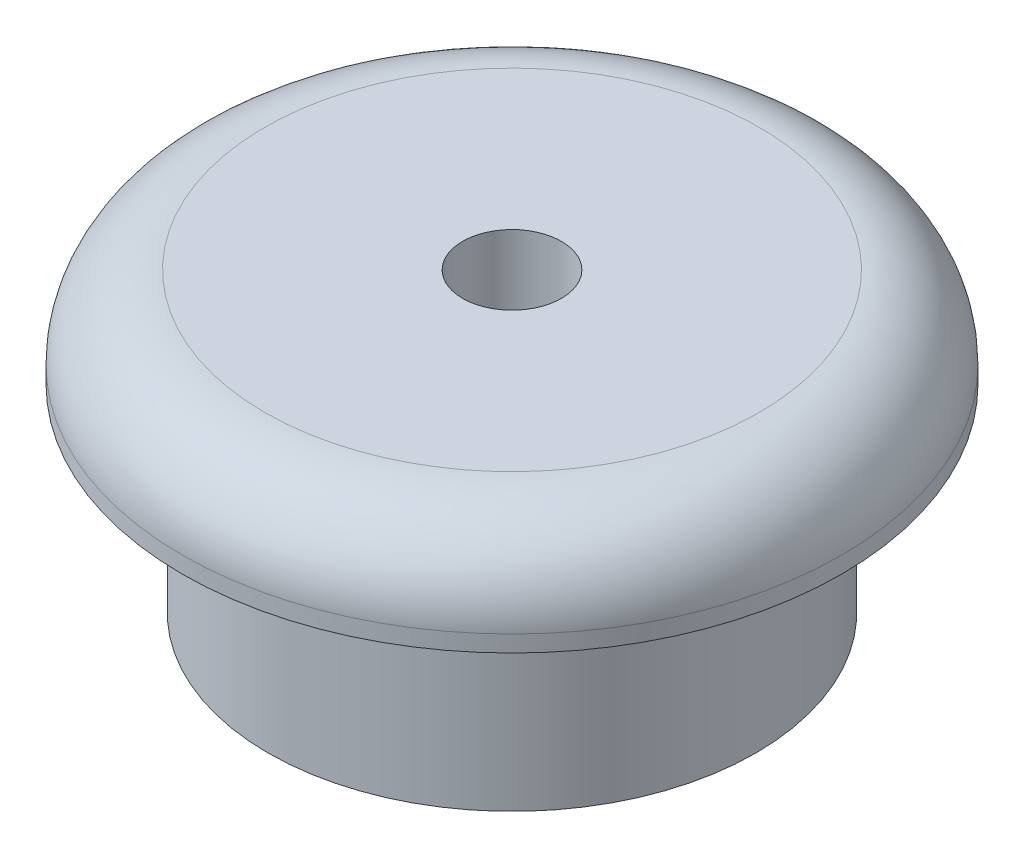
ISO-10303-21;
HEADER;
FILE_DESCRIPTION(('STEP AP214'),'2;1');
FILE_NAME('part.step','',(''),(''),'','','');
FILE_SCHEMA(('AUTOMOTIVE_DESIGN { 1 0 10303 214 1 1 1 1 }'));
ENDSEC;
DATA;
#1=APPLICATION_CONTEXT('core data for automotive mechanical design processes');
#2=APPLICATION_PROTOCOL_DEFINITION('international standard','automotive_design',2000,#1);
#3=PRODUCT_CONTEXT('',#1,'mechanical');
#4=PRODUCT('Part','Part','',(#3));
#5=PRODUCT_RELATED_PRODUCT_CATEGORY('part','',(#4));
#6=PRODUCT_DEFINITION_FORMATION('','',#4);
#7=PRODUCT_DEFINITION_CONTEXT('part definition',#1,'design');
#8=PRODUCT_DEFINITION('design','',#6,#7);
#9=PRODUCT_DEFINITION_SHAPE('','',#8);
#10=(LENGTH_UNIT() NAMED_UNIT(*) SI_UNIT(.MILLI.,.METRE.));
#11=(NAMED_UNIT(*) PLANE_ANGLE_UNIT() SI_UNIT($,.RADIAN.));
#12=(NAMED_UNIT(*) SI_UNIT($,.STERADIAN.) SOLID_ANGLE_UNIT());
#13=UNCERTAINTY_MEASURE_WITH_UNIT(LENGTH_MEASURE(1.E-05),#10,'distance_accuracy_value','');
#14=(GEOMETRIC_REPRESENTATION_CONTEXT(3) GLOBAL_UNCERTAINTY_ASSIGNED_CONTEXT((#13)) GLOBAL_UNIT_ASSIGNED_CONTEXT((#10,
#11,#12)) REPRESENTATION_CONTEXT('',''));
#15=CARTESIAN_POINT('',(0.,0.,0.));
#16=DIRECTION('',(0.,0.,1.));
#17=DIRECTION('',(1.,0.,0.));
#18=AXIS2_PLACEMENT_3D('',#15,#16,#17);
#19=CARTESIAN_POINT('',(0.,0.,0.));
#20=DIRECTION('',(0.,1.,0.));
#21=DIRECTION('',(0.,0.,1.));
#22=AXIS2_PLACEMENT_3D('',#19,#20,#21);
#23=PLANE('',#22);
#24=CARTESIAN_POINT('',(0.,0.,0.));
#25=DIRECTION('',(0.,1.,0.));
#26=DIRECTION('',(0.,0.,1.));
#27=AXIS2_PLACEMENT_3D('',#24,#25,#26);
#28=CIRCLE('',#27,7.4);
#29=CARTESIAN_POINT('',(0.,0.,7.4));
#30=VERTEX_POINT('',#29);
#31=EDGE_CURVE('E88',#30,#30,#28,.T.);
#32=ORIENTED_EDGE('',*,*,#31,.F.);
#33=EDGE_LOOP('',(#32));
#34=FACE_BOUND('',#33,.T.);
#35=CARTESIAN_POINT('',(0.,0.,0.));
#36=DIRECTION('',(0.,1.,0.));
#37=DIRECTION('',(0.,0.,1.));
#38=AXIS2_PLACEMENT_3D('',#35,#36,#37);
#39=CIRCLE('',#38,3.125);
#40=CARTESIAN_POINT('',(2.2,0.,-2.21937491199662));
#41=VERTEX_POINT('',#40);
#42=CARTESIAN_POINT('',(2.2,0.,2.21937491199662));
#43=VERTEX_POINT('',#42);
#44=EDGE_CURVE('E69',#41,#43,#39,.T.);
#45=ORIENTED_EDGE('',*,*,#44,.T.);
#46=DIRECTION('',(0.,0.,-1.));
#47=VECTOR('',#46,1.);
#48=CARTESIAN_POINT('',(2.2,0.,-2.21937491199662));
#49=LINE('',#48,#47);
#50=EDGE_CURVE('E78',#43,#41,#49,.T.);
#51=ORIENTED_EDGE('',*,*,#50,.T.);
#52=EDGE_LOOP('',(#45,#51));
#53=FACE_BOUND('',#52,.T.);
#54=ADVANCED_FACE('F47',(#34,#53),#23,.F.);
#55=CARTESIAN_POINT('',(0.,6.,0.));
#56=DIRECTION('',(0.,-1.,0.));
#57=DIRECTION('',(0.,0.,-1.));
#58=AXIS2_PLACEMENT_3D('',#55,#56,#57);
#59=CYLINDRICAL_SURFACE('',#58,7.4);
#60=CARTESIAN_POINT('',(0.,6.,0.));
#61=DIRECTION('',(0.,1.,0.));
#62=DIRECTION('',(0.,0.,1.));
#63=AXIS2_PLACEMENT_3D('',#60,#61,#62);
#64=CIRCLE('',#63,7.4);
#65=CARTESIAN_POINT('',(0.,6.,7.4));
#66=VERTEX_POINT('',#65);
#67=EDGE_CURVE('E93',#66,#66,#64,.T.);
#68=ORIENTED_EDGE('',*,*,#67,.F.);
#69=EDGE_LOOP('',(#68));
#70=FACE_BOUND('',#69,.T.);
#71=ORIENTED_EDGE('',*,*,#31,.T.);
#72=EDGE_LOOP('',(#71));
#73=FACE_BOUND('',#72,.T.);
#74=ADVANCED_FACE('F115',(#70,#73),#59,.T.);
#75=CARTESIAN_POINT('',(0.,6.,0.));
#76=DIRECTION('',(0.,-1.,0.));
#77=DIRECTION('',(0.,0.,-1.));
#78=AXIS2_PLACEMENT_3D('',#75,#76,#77);
#79=CYLINDRICAL_SURFACE('',#78,3.125);
#80=ORIENTED_EDGE('',*,*,#44,.F.);
#81=DIRECTION('',(0.,-1.,0.));
#82=VECTOR('',#81,1.);
#83=CARTESIAN_POINT('',(2.2,6.,-2.21937491199662));
#84=LINE('',#83,#82);
#85=CARTESIAN_POINT('',(2.2,6.,-2.21937491199662));
#86=VERTEX_POINT('',#85);
#87=EDGE_CURVE('E82',#86,#41,#84,.T.);
#88=ORIENTED_EDGE('',*,*,#87,.F.);
#89=CARTESIAN_POINT('',(0.,6.,0.));
#90=DIRECTION('',(0.,1.,0.));
#91=DIRECTION('',(0.,0.,1.));
#92=AXIS2_PLACEMENT_3D('',#89,#90,#91);
#93=CIRCLE('',#92,3.125);
#94=CARTESIAN_POINT('',(2.2,6.,2.21937491199662));
#95=VERTEX_POINT('',#94);
#96=EDGE_CURVE('E76',#86,#95,#93,.T.);
#97=ORIENTED_EDGE('',*,*,#96,.T.);
#98=DIRECTION('',(0.,-1.,0.));
#99=VECTOR('',#98,1.);
#100=CARTESIAN_POINT('',(2.2,6.,2.21937491199662));
#101=LINE('',#100,#99);
#102=EDGE_CURVE('E84',#95,#43,#101,.T.);
#103=ORIENTED_EDGE('',*,*,#102,.T.);
#104=EDGE_LOOP('',(#80,#88,#97,#103));
#105=FACE_BOUND('',#104,.T.);
#106=ADVANCED_FACE('F86',(#105),#79,.F.);
#107=CARTESIAN_POINT('',(2.2,6.,-2.21937491199662));
#108=DIRECTION('',(-1.,0.,0.));
#109=DIRECTION('',(0.,0.,1.));
#110=AXIS2_PLACEMENT_3D('',#107,#108,#109);
#111=PLANE('',#110);
#112=ORIENTED_EDGE('',*,*,#50,.F.);
#113=ORIENTED_EDGE('',*,*,#102,.F.);
#114=DIRECTION('',(0.,0.,-1.));
#115=VECTOR('',#114,1.);
#116=CARTESIAN_POINT('',(2.2,6.,-2.21937491199662));
#117=LINE('',#116,#115);
#118=EDGE_CURVE('E61',#95,#86,#117,.T.);
#119=ORIENTED_EDGE('',*,*,#118,.T.);
#120=ORIENTED_EDGE('',*,*,#87,.T.);
#121=EDGE_LOOP('',(#112,#113,#119,#120));
#122=FACE_BOUND('',#121,.T.);
#123=ADVANCED_FACE('F81',(#122),#111,.T.);
#124=CARTESIAN_POINT('',(0.,6.,0.));
#125=DIRECTION('',(0.,1.,0.));
#126=DIRECTION('',(0.,0.,1.));
#127=AXIS2_PLACEMENT_3D('',#124,#125,#126);
#128=PLANE('',#127);
#129=CARTESIAN_POINT('',(0.,6.,0.));
#130=DIRECTION('',(0.,1.,0.));
#131=DIRECTION('',(0.,0.,1.));
#132=AXIS2_PLACEMENT_3D('',#129,#130,#131);
#133=CIRCLE('',#132,1.5);
#134=CARTESIAN_POINT('',(0.,6.,1.5));
#135=VERTEX_POINT('',#134);
#136=EDGE_CURVE('E144',#135,#135,#133,.T.);
#137=ORIENTED_EDGE('',*,*,#136,.T.);
#138=EDGE_LOOP('',(#137));
#139=FACE_BOUND('',#138,.T.);
#140=ORIENTED_EDGE('',*,*,#118,.F.);
#141=ORIENTED_EDGE('',*,*,#96,.F.);
#142=EDGE_LOOP('',(#140,#141));
#143=FACE_BOUND('',#142,.T.);
#144=ADVANCED_FACE('F77',(#139,#143),#128,.F.);
#145=CARTESIAN_POINT('',(0.,9.,0.));
#146=DIRECTION('',(0.,1.,0.));
#147=DIRECTION('',(0.,0.,1.));
#148=AXIS2_PLACEMENT_3D('',#145,#146,#147);
#149=PLANE('',#148);
#150=CARTESIAN_POINT('',(0.,9.,0.));
#151=DIRECTION('',(0.,1.,0.));
#152=DIRECTION('',(0.,0.,1.));
#153=AXIS2_PLACEMENT_3D('',#150,#151,#152);
#154=CIRCLE('',#153,7.5);
#155=CARTESIAN_POINT('',(0.,9.,7.5));
#156=VERTEX_POINT('',#155);
#157=EDGE_CURVE('E55',#156,#156,#154,.T.);
#158=ORIENTED_EDGE('',*,*,#157,.T.);
#159=EDGE_LOOP('',(#158));
#160=FACE_BOUND('',#159,.T.);
#161=CARTESIAN_POINT('',(0.,9.,0.));
#162=DIRECTION('',(0.,1.,0.));
#163=DIRECTION('',(0.,0.,1.));
#164=AXIS2_PLACEMENT_3D('',#161,#162,#163);
#165=CIRCLE('',#164,1.5);
#166=CARTESIAN_POINT('',(0.,9.,1.5));
#167=VERTEX_POINT('',#166);
#168=EDGE_CURVE('E146',#167,#167,#165,.T.);
#169=ORIENTED_EDGE('',*,*,#168,.F.);
#170=EDGE_LOOP('',(#169));
#171=FACE_BOUND('',#170,.T.);
#172=ADVANCED_FACE('F100',(#160,#171),#149,.T.);
#173=ORIENTED_EDGE('',*,*,#67,.T.);
#174=EDGE_LOOP('',(#173));
#175=FACE_BOUND('',#174,.T.);
#176=CARTESIAN_POINT('',(0.,6.,0.));
#177=DIRECTION('',(0.,1.,0.));
#178=DIRECTION('',(0.,0.,1.));
#179=AXIS2_PLACEMENT_3D('',#176,#177,#178);
#180=CIRCLE('',#179,10.);
#181=CARTESIAN_POINT('',(0.,6.,10.));
#182=VERTEX_POINT('',#181);
#183=EDGE_CURVE('E149',#182,#182,#180,.T.);
#184=ORIENTED_EDGE('',*,*,#183,.F.);
#185=EDGE_LOOP('',(#184));
#186=FACE_BOUND('',#185,.T.);
#187=ADVANCED_FACE('F130',(#175,#186),#128,.F.);
#188=CARTESIAN_POINT('',(0.,9.,0.));
#189=DIRECTION('',(0.,-1.,0.));
#190=DIRECTION('',(0.,0.,-1.));
#191=AXIS2_PLACEMENT_3D('',#188,#189,#190);
#192=CYLINDRICAL_SURFACE('',#191,10.);
#193=CARTESIAN_POINT('',(0.,6.5,0.));
#194=DIRECTION('',(0.,1.,0.));
#195=DIRECTION('',(0.,0.,1.));
#196=AXIS2_PLACEMENT_3D('',#193,#194,#195);
#197=CIRCLE('',#196,10.);
#198=CARTESIAN_POINT('',(0.,6.5,10.));
#199=VERTEX_POINT('',#198);
#200=EDGE_CURVE('E12',#199,#199,#197,.F.);
#201=ORIENTED_EDGE('',*,*,#200,.T.);
#202=EDGE_LOOP('',(#201));
#203=FACE_BOUND('',#202,.T.);
#204=ORIENTED_EDGE('',*,*,#183,.T.);
#205=EDGE_LOOP('',(#204));
#206=FACE_BOUND('',#205,.T.);
#207=ADVANCED_FACE('F110',(#203,#206),#192,.T.);
#208=CARTESIAN_POINT('',(0.,9.,0.));
#209=DIRECTION('',(0.,-1.,0.));
#210=DIRECTION('',(0.,0.,-1.));
#211=AXIS2_PLACEMENT_3D('',#208,#209,#210);
#212=CYLINDRICAL_SURFACE('',#211,1.5);
#213=ORIENTED_EDGE('',*,*,#168,.T.);
#214=EDGE_LOOP('',(#213));
#215=FACE_BOUND('',#214,.T.);
#216=ORIENTED_EDGE('',*,*,#136,.F.);
#217=EDGE_LOOP('',(#216));
#218=FACE_BOUND('',#217,.T.);
#219=ADVANCED_FACE('F104',(#215,#218),#212,.F.);
#220=CARTESIAN_POINT('',(0.,6.5,0.));
#221=DIRECTION('',(0.,1.,0.));
#222=DIRECTION('',(0.,0.,1.));
#223=AXIS2_PLACEMENT_3D('',#220,#221,#222);
#224=TOROIDAL_SURFACE('',#223,7.5,2.5);
#225=ORIENTED_EDGE('',*,*,#200,.F.);
#226=EDGE_LOOP('',(#225));
#227=FACE_BOUND('',#226,.T.);
#228=ORIENTED_EDGE('',*,*,#157,.F.);
#229=EDGE_LOOP('',(#228));
#230=FACE_BOUND('',#229,.T.);
#231=ADVANCED_FACE('F49',(#227,#230),#224,.T.);
#232=CLOSED_SHELL('',(#54,#74,#106,#123,#144,#172,#187,#207,#219,#231));
#233=MANIFOLD_SOLID_BREP('B2',#232);
#234=ADVANCED_BREP_SHAPE_REPRESENTATION('',(#18,#233),#14);
#235=SHAPE_DEFINITION_REPRESENTATION(#9,#234);
ENDSEC;
END-ISO-10303-21;
